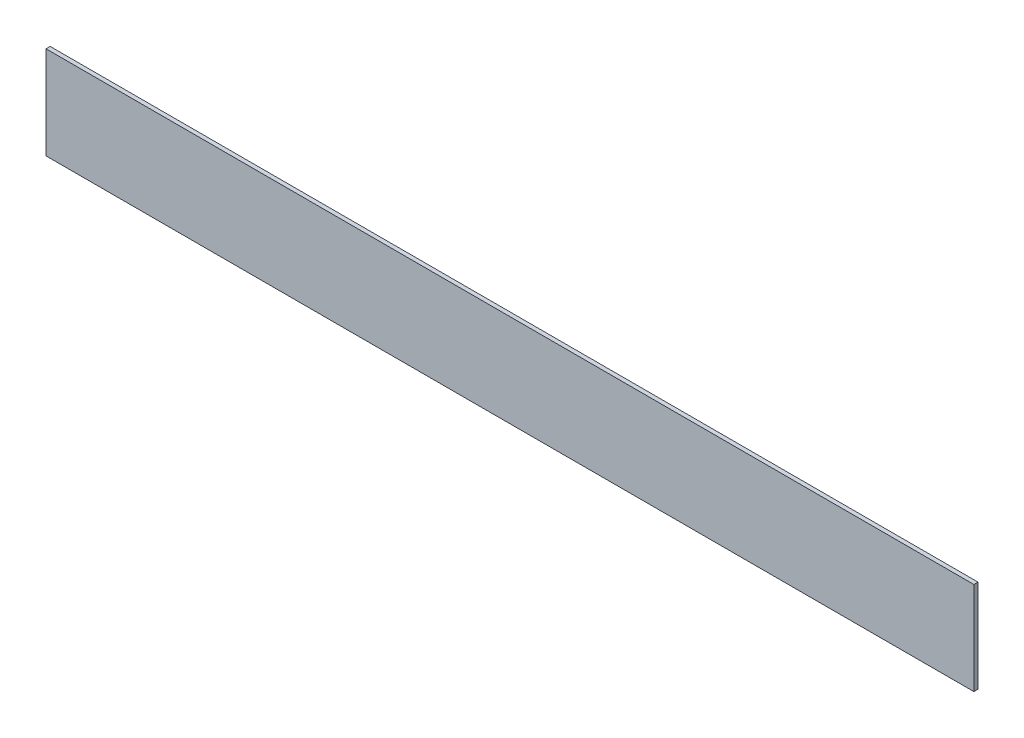
ISO-10303-21;
HEADER;
FILE_DESCRIPTION(('STEP AP214'),'2;1');
FILE_NAME('part.step','',(''),(''),'','','');
FILE_SCHEMA(('AUTOMOTIVE_DESIGN { 1 0 10303 214 1 1 1 1 }'));
ENDSEC;
DATA;
#1=APPLICATION_CONTEXT('core data for automotive mechanical design processes');
#2=APPLICATION_PROTOCOL_DEFINITION('international standard','automotive_design',2000,#1);
#3=PRODUCT_CONTEXT('',#1,'mechanical');
#4=PRODUCT('Part','Part','',(#3));
#5=PRODUCT_RELATED_PRODUCT_CATEGORY('part','',(#4));
#6=PRODUCT_DEFINITION_FORMATION('','',#4);
#7=PRODUCT_DEFINITION_CONTEXT('part definition',#1,'design');
#8=PRODUCT_DEFINITION('design','',#6,#7);
#9=PRODUCT_DEFINITION_SHAPE('','',#8);
#10=(LENGTH_UNIT() NAMED_UNIT(*) SI_UNIT(.MILLI.,.METRE.));
#11=(NAMED_UNIT(*) PLANE_ANGLE_UNIT() SI_UNIT($,.RADIAN.));
#12=(NAMED_UNIT(*) SI_UNIT($,.STERADIAN.) SOLID_ANGLE_UNIT());
#13=UNCERTAINTY_MEASURE_WITH_UNIT(LENGTH_MEASURE(1.E-05),#10,'distance_accuracy_value','');
#14=(GEOMETRIC_REPRESENTATION_CONTEXT(3) GLOBAL_UNCERTAINTY_ASSIGNED_CONTEXT((#13)) GLOBAL_UNIT_ASSIGNED_CONTEXT((#10,
#11,#12)) REPRESENTATION_CONTEXT('',''));
#15=CARTESIAN_POINT('',(0.,0.,0.));
#16=DIRECTION('',(0.,0.,1.));
#17=DIRECTION('',(1.,0.,0.));
#18=AXIS2_PLACEMENT_3D('',#15,#16,#17);
#19=CARTESIAN_POINT('',(225.,22.5,2.));
#20=DIRECTION('',(-1.,0.,0.));
#21=DIRECTION('',(0.,-1.,0.));
#22=AXIS2_PLACEMENT_3D('',#19,#20,#21);
#23=PLANE('',#22);
#24=DIRECTION('',(0.,1.,0.));
#25=VECTOR('',#24,1.);
#26=CARTESIAN_POINT('',(225.,22.5,0.));
#27=LINE('',#26,#25);
#28=CARTESIAN_POINT('',(225.,-22.5,0.));
#29=VERTEX_POINT('',#28);
#30=CARTESIAN_POINT('',(225.,22.5,0.));
#31=VERTEX_POINT('',#30);
#32=EDGE_CURVE('E112',#29,#31,#27,.T.);
#33=ORIENTED_EDGE('',*,*,#32,.T.);
#34=DIRECTION('',(0.,0.,-1.));
#35=VECTOR('',#34,1.);
#36=CARTESIAN_POINT('',(225.,22.5,2.));
#37=LINE('',#36,#35);
#38=CARTESIAN_POINT('',(225.,22.5,2.));
#39=VERTEX_POINT('',#38);
#40=EDGE_CURVE('E11',#39,#31,#37,.T.);
#41=ORIENTED_EDGE('',*,*,#40,.F.);
#42=DIRECTION('',(0.,1.,0.));
#43=VECTOR('',#42,1.);
#44=CARTESIAN_POINT('',(225.,22.5,2.));
#45=LINE('',#44,#43);
#46=CARTESIAN_POINT('',(225.,-22.5,2.));
#47=VERTEX_POINT('',#46);
#48=EDGE_CURVE('E96',#47,#39,#45,.T.);
#49=ORIENTED_EDGE('',*,*,#48,.F.);
#50=DIRECTION('',(0.,0.,-1.));
#51=VECTOR('',#50,1.);
#52=CARTESIAN_POINT('',(225.,-22.5,2.));
#53=LINE('',#52,#51);
#54=EDGE_CURVE('E108',#47,#29,#53,.T.);
#55=ORIENTED_EDGE('',*,*,#54,.T.);
#56=EDGE_LOOP('',(#33,#41,#49,#55));
#57=FACE_BOUND('',#56,.T.);
#58=ADVANCED_FACE('F44',(#57),#23,.F.);
#59=CARTESIAN_POINT('',(-225.,22.5,2.));
#60=DIRECTION('',(0.,-1.,0.));
#61=DIRECTION('',(0.,0.,-1.));
#62=AXIS2_PLACEMENT_3D('',#59,#60,#61);
#63=PLANE('',#62);
#64=DIRECTION('',(-1.,0.,0.));
#65=VECTOR('',#64,1.);
#66=CARTESIAN_POINT('',(-225.,22.5,0.));
#67=LINE('',#66,#65);
#68=CARTESIAN_POINT('',(-225.,22.5,0.));
#69=VERTEX_POINT('',#68);
#70=EDGE_CURVE('E101',#31,#69,#67,.T.);
#71=ORIENTED_EDGE('',*,*,#70,.T.);
#72=DIRECTION('',(0.,0.,-1.));
#73=VECTOR('',#72,1.);
#74=CARTESIAN_POINT('',(-225.,22.5,2.));
#75=LINE('',#74,#73);
#76=CARTESIAN_POINT('',(-225.,22.5,2.));
#77=VERTEX_POINT('',#76);
#78=EDGE_CURVE('E53',#77,#69,#75,.T.);
#79=ORIENTED_EDGE('',*,*,#78,.F.);
#80=DIRECTION('',(-1.,0.,0.));
#81=VECTOR('',#80,1.);
#82=CARTESIAN_POINT('',(-225.,22.5,2.));
#83=LINE('',#82,#81);
#84=EDGE_CURVE('E91',#39,#77,#83,.T.);
#85=ORIENTED_EDGE('',*,*,#84,.F.);
#86=ORIENTED_EDGE('',*,*,#40,.T.);
#87=EDGE_LOOP('',(#71,#79,#85,#86));
#88=FACE_BOUND('',#87,.T.);
#89=ADVANCED_FACE('F100',(#88),#63,.F.);
#90=CARTESIAN_POINT('',(-225.,22.5,2.));
#91=DIRECTION('',(1.,0.,0.));
#92=DIRECTION('',(0.,1.,0.));
#93=AXIS2_PLACEMENT_3D('',#90,#91,#92);
#94=PLANE('',#93);
#95=DIRECTION('',(0.,-1.,0.));
#96=VECTOR('',#95,1.);
#97=CARTESIAN_POINT('',(-225.,22.5,0.));
#98=LINE('',#97,#96);
#99=CARTESIAN_POINT('',(-225.,-22.5,0.));
#100=VERTEX_POINT('',#99);
#101=EDGE_CURVE('E78',#69,#100,#98,.T.);
#102=ORIENTED_EDGE('',*,*,#101,.T.);
#103=DIRECTION('',(0.,0.,-1.));
#104=VECTOR('',#103,1.);
#105=CARTESIAN_POINT('',(-225.,-22.5,2.));
#106=LINE('',#105,#104);
#107=CARTESIAN_POINT('',(-225.,-22.5,2.));
#108=VERTEX_POINT('',#107);
#109=EDGE_CURVE('E103',#108,#100,#106,.T.);
#110=ORIENTED_EDGE('',*,*,#109,.F.);
#111=DIRECTION('',(0.,-1.,0.));
#112=VECTOR('',#111,1.);
#113=CARTESIAN_POINT('',(-225.,22.5,2.));
#114=LINE('',#113,#112);
#115=EDGE_CURVE('E94',#77,#108,#114,.T.);
#116=ORIENTED_EDGE('',*,*,#115,.F.);
#117=ORIENTED_EDGE('',*,*,#78,.T.);
#118=EDGE_LOOP('',(#102,#110,#116,#117));
#119=FACE_BOUND('',#118,.T.);
#120=ADVANCED_FACE('F104',(#119),#94,.F.);
#121=CARTESIAN_POINT('',(-225.,-22.5,2.));
#122=DIRECTION('',(0.,1.,0.));
#123=DIRECTION('',(0.,0.,1.));
#124=AXIS2_PLACEMENT_3D('',#121,#122,#123);
#125=PLANE('',#124);
#126=DIRECTION('',(1.,0.,0.));
#127=VECTOR('',#126,1.);
#128=CARTESIAN_POINT('',(-225.,-22.5,0.));
#129=LINE('',#128,#127);
#130=EDGE_CURVE('E84',#100,#29,#129,.T.);
#131=ORIENTED_EDGE('',*,*,#130,.T.);
#132=ORIENTED_EDGE('',*,*,#54,.F.);
#133=DIRECTION('',(1.,0.,0.));
#134=VECTOR('',#133,1.);
#135=CARTESIAN_POINT('',(-225.,-22.5,2.));
#136=LINE('',#135,#134);
#137=EDGE_CURVE('E61',#108,#47,#136,.T.);
#138=ORIENTED_EDGE('',*,*,#137,.F.);
#139=ORIENTED_EDGE('',*,*,#109,.T.);
#140=EDGE_LOOP('',(#131,#132,#138,#139));
#141=FACE_BOUND('',#140,.T.);
#142=ADVANCED_FACE('F125',(#141),#125,.F.);
#143=CARTESIAN_POINT('',(0.,0.,2.));
#144=DIRECTION('',(0.,0.,1.));
#145=DIRECTION('',(1.,0.,0.));
#146=AXIS2_PLACEMENT_3D('',#143,#144,#145);
#147=PLANE('',#146);
#148=ORIENTED_EDGE('',*,*,#48,.T.);
#149=ORIENTED_EDGE('',*,*,#84,.T.);
#150=ORIENTED_EDGE('',*,*,#115,.T.);
#151=ORIENTED_EDGE('',*,*,#137,.T.);
#152=EDGE_LOOP('',(#148,#149,#150,#151));
#153=FACE_BOUND('',#152,.T.);
#154=ADVANCED_FACE('F92',(#153),#147,.T.);
#155=CARTESIAN_POINT('',(0.,0.,0.));
#156=DIRECTION('',(0.,0.,1.));
#157=DIRECTION('',(1.,0.,0.));
#158=AXIS2_PLACEMENT_3D('',#155,#156,#157);
#159=PLANE('',#158);
#160=ORIENTED_EDGE('',*,*,#32,.F.);
#161=ORIENTED_EDGE('',*,*,#130,.F.);
#162=ORIENTED_EDGE('',*,*,#101,.F.);
#163=ORIENTED_EDGE('',*,*,#70,.F.);
#164=EDGE_LOOP('',(#160,#161,#162,#163));
#165=FACE_BOUND('',#164,.T.);
#166=ADVANCED_FACE('F128',(#165),#159,.F.);
#167=CLOSED_SHELL('',(#58,#89,#120,#142,#154,#166));
#168=MANIFOLD_SOLID_BREP('B2',#167);
#169=ADVANCED_BREP_SHAPE_REPRESENTATION('',(#18,#168),#14);
#170=SHAPE_DEFINITION_REPRESENTATION(#9,#169);
ENDSEC;
END-ISO-10303-21;
